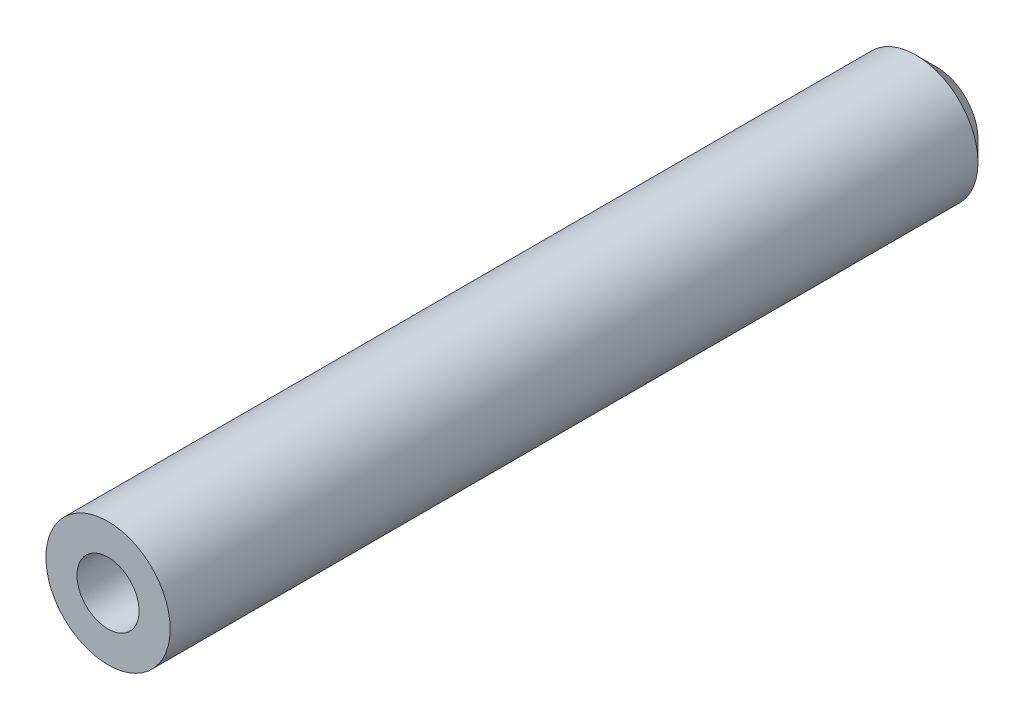
ISO-10303-21;
HEADER;
FILE_DESCRIPTION(('STEP AP214'),'2;1');
FILE_NAME('part.step','',(''),(''),'','','');
FILE_SCHEMA(('AUTOMOTIVE_DESIGN { 1 0 10303 214 1 1 1 1 }'));
ENDSEC;
DATA;
#1=APPLICATION_CONTEXT('core data for automotive mechanical design processes');
#2=APPLICATION_PROTOCOL_DEFINITION('international standard','automotive_design',2000,#1);
#3=PRODUCT_CONTEXT('',#1,'mechanical');
#4=PRODUCT('Part','Part','',(#3));
#5=PRODUCT_RELATED_PRODUCT_CATEGORY('part','',(#4));
#6=PRODUCT_DEFINITION_FORMATION('','',#4);
#7=PRODUCT_DEFINITION_CONTEXT('part definition',#1,'design');
#8=PRODUCT_DEFINITION('design','',#6,#7);
#9=PRODUCT_DEFINITION_SHAPE('','',#8);
#10=(LENGTH_UNIT() NAMED_UNIT(*) SI_UNIT(.MILLI.,.METRE.));
#11=(NAMED_UNIT(*) PLANE_ANGLE_UNIT() SI_UNIT($,.RADIAN.));
#12=(NAMED_UNIT(*) SI_UNIT($,.STERADIAN.) SOLID_ANGLE_UNIT());
#13=UNCERTAINTY_MEASURE_WITH_UNIT(LENGTH_MEASURE(1.E-05),#10,'distance_accuracy_value','');
#14=(GEOMETRIC_REPRESENTATION_CONTEXT(3) GLOBAL_UNCERTAINTY_ASSIGNED_CONTEXT((#13)) GLOBAL_UNIT_ASSIGNED_CONTEXT((#10,
#11,#12)) REPRESENTATION_CONTEXT('',''));
#15=CARTESIAN_POINT('',(0.,0.,0.));
#16=DIRECTION('',(0.,0.,1.));
#17=DIRECTION('',(1.,0.,0.));
#18=AXIS2_PLACEMENT_3D('',#15,#16,#17);
#19=CARTESIAN_POINT('',(0.,0.,0.));
#20=DIRECTION('',(0.,0.,1.));
#21=DIRECTION('',(1.,0.,0.));
#22=AXIS2_PLACEMENT_3D('',#19,#20,#21);
#23=CYLINDRICAL_SURFACE('',#22,3.);
#24=CARTESIAN_POINT('',(0.,0.,0.));
#25=DIRECTION('',(0.,0.,1.));
#26=DIRECTION('',(1.,0.,0.));
#27=AXIS2_PLACEMENT_3D('',#24,#25,#26);
#28=CIRCLE('',#27,3.);
#29=CARTESIAN_POINT('',(3.,0.,0.));
#30=VERTEX_POINT('',#29);
#31=EDGE_CURVE('E53',#30,#30,#28,.T.);
#32=ORIENTED_EDGE('',*,*,#31,.F.);
#33=EDGE_LOOP('',(#32));
#34=FACE_BOUND('',#33,.T.);
#35=CARTESIAN_POINT('',(0.,0.,-39.));
#36=DIRECTION('',(0.,0.,1.));
#37=DIRECTION('',(1.,0.,0.));
#38=AXIS2_PLACEMENT_3D('',#35,#36,#37);
#39=CIRCLE('',#38,3.);
#40=CARTESIAN_POINT('',(3.,0.,-39.));
#41=VERTEX_POINT('',#40);
#42=EDGE_CURVE('E10',#41,#41,#39,.T.);
#43=ORIENTED_EDGE('',*,*,#42,.T.);
#44=EDGE_LOOP('',(#43));
#45=FACE_BOUND('',#44,.T.);
#46=ADVANCED_FACE('F33',(#34,#45),#23,.T.);
#47=CARTESIAN_POINT('',(0.,0.,-40.));
#48=DIRECTION('',(0.,0.,1.));
#49=DIRECTION('',(1.,0.,0.));
#50=AXIS2_PLACEMENT_3D('',#47,#48,#49);
#51=CONICAL_SURFACE('',#50,2.,0.78539816339745);
#52=ORIENTED_EDGE('',*,*,#42,.F.);
#53=EDGE_LOOP('',(#52));
#54=FACE_BOUND('',#53,.T.);
#55=CARTESIAN_POINT('',(0.,0.,-40.));
#56=DIRECTION('',(0.,0.,1.));
#57=DIRECTION('',(1.,0.,0.));
#58=AXIS2_PLACEMENT_3D('',#55,#56,#57);
#59=CIRCLE('',#58,2.);
#60=CARTESIAN_POINT('',(2.,0.,-40.));
#61=VERTEX_POINT('',#60);
#62=EDGE_CURVE('E40',#61,#61,#59,.T.);
#63=ORIENTED_EDGE('',*,*,#62,.T.);
#64=EDGE_LOOP('',(#63));
#65=FACE_BOUND('',#64,.T.);
#66=ADVANCED_FACE('F60',(#54,#65),#51,.T.);
#67=CARTESIAN_POINT('',(-2.,0.,-40.));
#68=DIRECTION('',(0.,0.,1.));
#69=DIRECTION('',(1.,0.,0.));
#70=AXIS2_PLACEMENT_3D('',#67,#68,#69);
#71=PLANE('',#70);
#72=ORIENTED_EDGE('',*,*,#62,.F.);
#73=EDGE_LOOP('',(#72));
#74=FACE_BOUND('',#73,.T.);
#75=CARTESIAN_POINT('',(0.,0.,-40.));
#76=DIRECTION('',(0.,0.,1.));
#77=DIRECTION('',(1.,0.,0.));
#78=AXIS2_PLACEMENT_3D('',#75,#76,#77);
#79=CIRCLE('',#78,1.5);
#80=CARTESIAN_POINT('',(1.5,0.,-40.));
#81=VERTEX_POINT('',#80);
#82=EDGE_CURVE('E44',#81,#81,#79,.T.);
#83=ORIENTED_EDGE('',*,*,#82,.T.);
#84=EDGE_LOOP('',(#83));
#85=FACE_BOUND('',#84,.T.);
#86=ADVANCED_FACE('F64',(#74,#85),#71,.F.);
#87=CARTESIAN_POINT('',(0.,0.,0.));
#88=DIRECTION('',(0.,0.,1.));
#89=DIRECTION('',(1.,0.,0.));
#90=AXIS2_PLACEMENT_3D('',#87,#88,#89);
#91=CYLINDRICAL_SURFACE('',#90,1.5);
#92=ORIENTED_EDGE('',*,*,#82,.F.);
#93=EDGE_LOOP('',(#92));
#94=FACE_BOUND('',#93,.T.);
#95=CARTESIAN_POINT('',(0.,0.,0.));
#96=DIRECTION('',(0.,0.,1.));
#97=DIRECTION('',(1.,0.,0.));
#98=AXIS2_PLACEMENT_3D('',#95,#96,#97);
#99=CIRCLE('',#98,1.5);
#100=CARTESIAN_POINT('',(1.5,0.,0.));
#101=VERTEX_POINT('',#100);
#102=EDGE_CURVE('E48',#101,#101,#99,.T.);
#103=ORIENTED_EDGE('',*,*,#102,.T.);
#104=EDGE_LOOP('',(#103));
#105=FACE_BOUND('',#104,.T.);
#106=ADVANCED_FACE('F69',(#94,#105),#91,.F.);
#107=CARTESIAN_POINT('',(-1.5,0.,0.));
#108=DIRECTION('',(0.,0.,-1.));
#109=DIRECTION('',(-1.,0.,0.));
#110=AXIS2_PLACEMENT_3D('',#107,#108,#109);
#111=PLANE('',#110);
#112=ORIENTED_EDGE('',*,*,#102,.F.);
#113=EDGE_LOOP('',(#112));
#114=FACE_BOUND('',#113,.T.);
#115=ORIENTED_EDGE('',*,*,#31,.T.);
#116=EDGE_LOOP('',(#115));
#117=FACE_BOUND('',#116,.T.);
#118=ADVANCED_FACE('F57',(#114,#117),#111,.F.);
#119=CLOSED_SHELL('',(#46,#66,#86,#106,#118));
#120=MANIFOLD_SOLID_BREP('B2',#119);
#121=ADVANCED_BREP_SHAPE_REPRESENTATION('',(#18,#120),#14);
#122=SHAPE_DEFINITION_REPRESENTATION(#9,#121);
ENDSEC;
END-ISO-10303-21;
